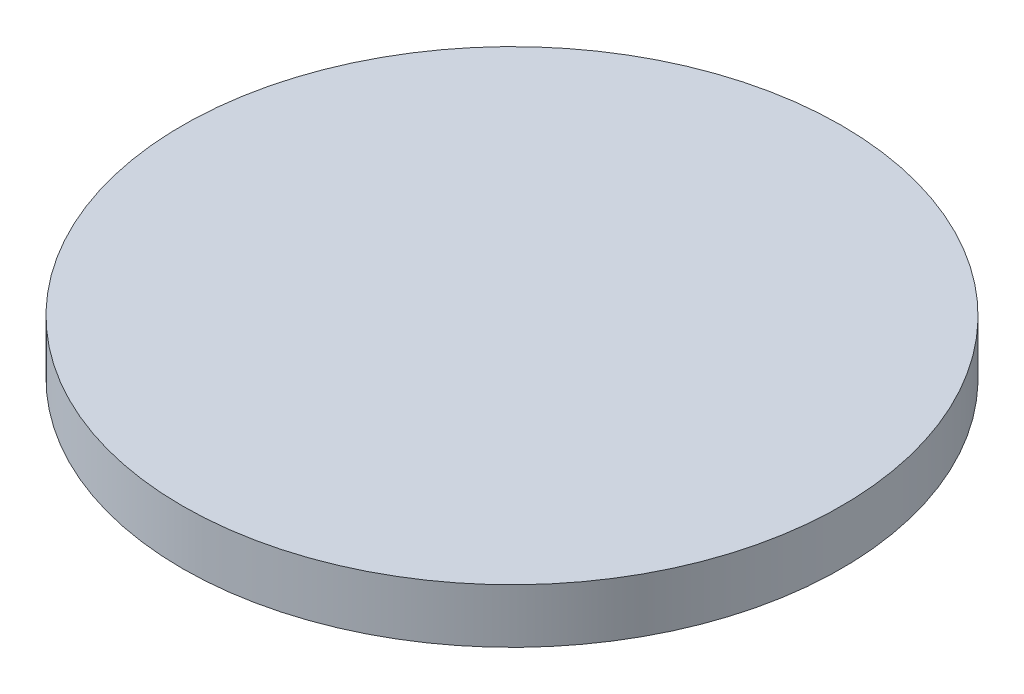
ISO-10303-21;
HEADER;
FILE_DESCRIPTION(('STEP AP214'),'2;1');
FILE_NAME('part.step','',(''),(''),'','','');
FILE_SCHEMA(('AUTOMOTIVE_DESIGN { 1 0 10303 214 1 1 1 1 }'));
ENDSEC;
DATA;
#1=APPLICATION_CONTEXT('core data for automotive mechanical design processes');
#2=APPLICATION_PROTOCOL_DEFINITION('international standard','automotive_design',2000,#1);
#3=PRODUCT_CONTEXT('',#1,'mechanical');
#4=PRODUCT('Part','Part','',(#3));
#5=PRODUCT_RELATED_PRODUCT_CATEGORY('part','',(#4));
#6=PRODUCT_DEFINITION_FORMATION('','',#4);
#7=PRODUCT_DEFINITION_CONTEXT('part definition',#1,'design');
#8=PRODUCT_DEFINITION('design','',#6,#7);
#9=PRODUCT_DEFINITION_SHAPE('','',#8);
#10=(LENGTH_UNIT() NAMED_UNIT(*) SI_UNIT(.MILLI.,.METRE.));
#11=(NAMED_UNIT(*) PLANE_ANGLE_UNIT() SI_UNIT($,.RADIAN.));
#12=(NAMED_UNIT(*) SI_UNIT($,.STERADIAN.) SOLID_ANGLE_UNIT());
#13=UNCERTAINTY_MEASURE_WITH_UNIT(LENGTH_MEASURE(1.E-05),#10,'distance_accuracy_value','');
#14=(GEOMETRIC_REPRESENTATION_CONTEXT(3) GLOBAL_UNCERTAINTY_ASSIGNED_CONTEXT((#13)) GLOBAL_UNIT_ASSIGNED_CONTEXT((#10,
#11,#12)) REPRESENTATION_CONTEXT('',''));
#15=CARTESIAN_POINT('',(0.,0.,0.));
#16=DIRECTION('',(0.,0.,1.));
#17=DIRECTION('',(1.,0.,0.));
#18=AXIS2_PLACEMENT_3D('',#15,#16,#17);
#19=CARTESIAN_POINT('',(0.,40.,0.));
#20=DIRECTION('',(0.,-1.,0.));
#21=DIRECTION('',(0.,0.,-1.));
#22=AXIS2_PLACEMENT_3D('',#19,#20,#21);
#23=CYLINDRICAL_SURFACE('',#22,243.);
#24=CARTESIAN_POINT('',(0.,40.,0.));
#25=DIRECTION('',(0.,1.,0.));
#26=DIRECTION('',(0.,0.,1.));
#27=AXIS2_PLACEMENT_3D('',#24,#25,#26);
#28=CIRCLE('',#27,243.);
#29=CARTESIAN_POINT('',(0.,40.,243.));
#30=VERTEX_POINT('',#29);
#31=EDGE_CURVE('E10',#30,#30,#28,.T.);
#32=ORIENTED_EDGE('',*,*,#31,.F.);
#33=EDGE_LOOP('',(#32));
#34=FACE_BOUND('',#33,.T.);
#35=CARTESIAN_POINT('',(0.,0.,0.));
#36=DIRECTION('',(0.,1.,0.));
#37=DIRECTION('',(0.,0.,1.));
#38=AXIS2_PLACEMENT_3D('',#35,#36,#37);
#39=CIRCLE('',#38,243.);
#40=CARTESIAN_POINT('',(0.,0.,243.));
#41=VERTEX_POINT('',#40);
#42=EDGE_CURVE('E34',#41,#41,#39,.T.);
#43=ORIENTED_EDGE('',*,*,#42,.T.);
#44=EDGE_LOOP('',(#43));
#45=FACE_BOUND('',#44,.T.);
#46=ADVANCED_FACE('F31',(#34,#45),#23,.T.);
#47=CARTESIAN_POINT('',(0.,40.,0.));
#48=DIRECTION('',(0.,1.,0.));
#49=DIRECTION('',(0.,0.,1.));
#50=AXIS2_PLACEMENT_3D('',#47,#48,#49);
#51=PLANE('',#50);
#52=ORIENTED_EDGE('',*,*,#31,.T.);
#53=EDGE_LOOP('',(#52));
#54=FACE_BOUND('',#53,.T.);
#55=ADVANCED_FACE('F62',(#54),#51,.T.);
#56=CARTESIAN_POINT('',(0.,0.,0.));
#57=DIRECTION('',(0.,1.,0.));
#58=DIRECTION('',(0.,0.,1.));
#59=AXIS2_PLACEMENT_3D('',#56,#57,#58);
#60=PLANE('',#59);
#61=CARTESIAN_POINT('',(0.,0.,0.));
#62=DIRECTION('',(0.,1.,0.));
#63=DIRECTION('',(0.,0.,1.));
#64=AXIS2_PLACEMENT_3D('',#61,#62,#63);
#65=CIRCLE('',#64,233.);
#66=CARTESIAN_POINT('',(0.,0.,233.));
#67=VERTEX_POINT('',#66);
#68=EDGE_CURVE('E43',#67,#67,#65,.T.);
#69=ORIENTED_EDGE('',*,*,#68,.T.);
#70=EDGE_LOOP('',(#69));
#71=FACE_BOUND('',#70,.T.);
#72=ORIENTED_EDGE('',*,*,#42,.F.);
#73=EDGE_LOOP('',(#72));
#74=FACE_BOUND('',#73,.T.);
#75=ADVANCED_FACE('F58',(#71,#74),#60,.F.);
#76=CARTESIAN_POINT('',(0.,40.,0.));
#77=DIRECTION('',(0.,-1.,0.));
#78=DIRECTION('',(0.,0.,-1.));
#79=AXIS2_PLACEMENT_3D('',#76,#77,#78);
#80=CYLINDRICAL_SURFACE('',#79,233.);
#81=CARTESIAN_POINT('',(0.,30.,0.));
#82=DIRECTION('',(0.,1.,0.));
#83=DIRECTION('',(0.,0.,1.));
#84=AXIS2_PLACEMENT_3D('',#81,#82,#83);
#85=CIRCLE('',#84,233.);
#86=CARTESIAN_POINT('',(0.,30.,233.));
#87=VERTEX_POINT('',#86);
#88=EDGE_CURVE('E41',#87,#87,#85,.T.);
#89=ORIENTED_EDGE('',*,*,#88,.T.);
#90=EDGE_LOOP('',(#89));
#91=FACE_BOUND('',#90,.T.);
#92=ORIENTED_EDGE('',*,*,#68,.F.);
#93=EDGE_LOOP('',(#92));
#94=FACE_BOUND('',#93,.T.);
#95=ADVANCED_FACE('F49',(#91,#94),#80,.F.);
#96=CARTESIAN_POINT('',(0.,30.,0.));
#97=DIRECTION('',(0.,1.,0.));
#98=DIRECTION('',(0.,0.,1.));
#99=AXIS2_PLACEMENT_3D('',#96,#97,#98);
#100=PLANE('',#99);
#101=ORIENTED_EDGE('',*,*,#88,.F.);
#102=EDGE_LOOP('',(#101));
#103=FACE_BOUND('',#102,.T.);
#104=ADVANCED_FACE('F52',(#103),#100,.F.);
#105=CLOSED_SHELL('',(#46,#55,#75,#95,#104));
#106=MANIFOLD_SOLID_BREP('B2',#105);
#107=ADVANCED_BREP_SHAPE_REPRESENTATION('',(#18,#106),#14);
#108=SHAPE_DEFINITION_REPRESENTATION(#9,#107);
ENDSEC;
END-ISO-10303-21;
